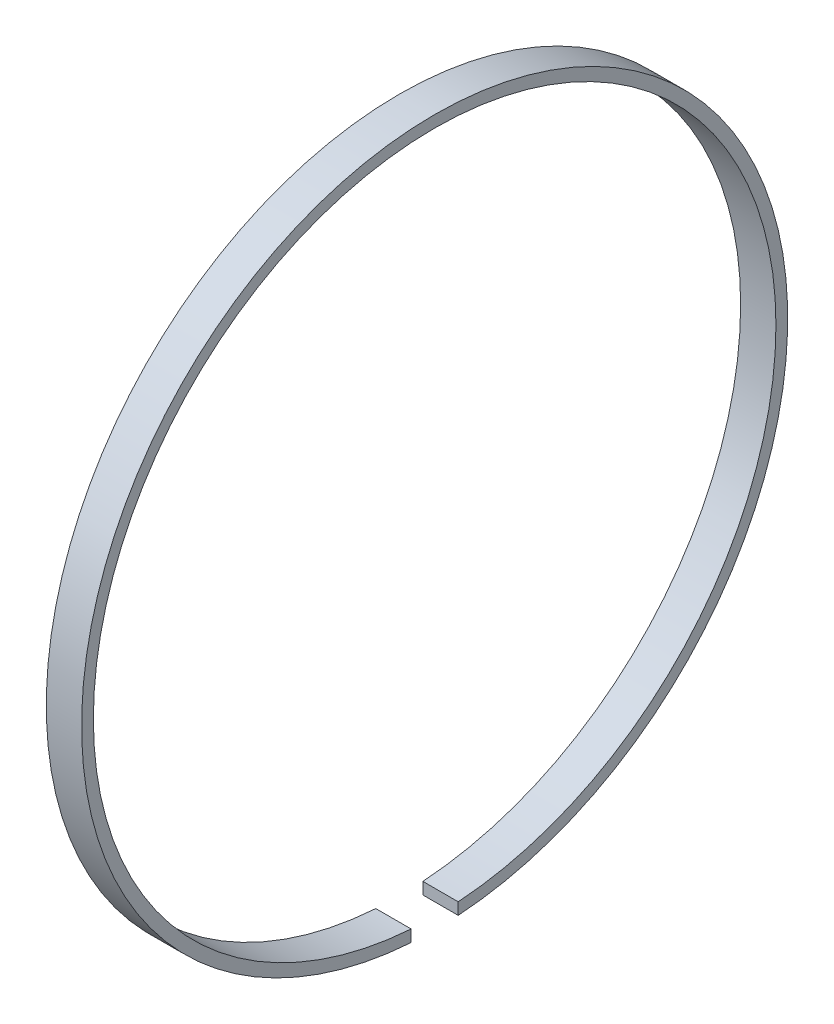
ISO-10303-21;
HEADER;
FILE_DESCRIPTION(('STEP AP214'),'2;1');
FILE_NAME('part.step','',(''),(''),'','','');
FILE_SCHEMA(('AUTOMOTIVE_DESIGN { 1 0 10303 214 1 1 1 1 }'));
ENDSEC;
DATA;
#1=APPLICATION_CONTEXT('core data for automotive mechanical design processes');
#2=APPLICATION_PROTOCOL_DEFINITION('international standard','automotive_design',2000,#1);
#3=PRODUCT_CONTEXT('',#1,'mechanical');
#4=PRODUCT('Part','Part','',(#3));
#5=PRODUCT_RELATED_PRODUCT_CATEGORY('part','',(#4));
#6=PRODUCT_DEFINITION_FORMATION('','',#4);
#7=PRODUCT_DEFINITION_CONTEXT('part definition',#1,'design');
#8=PRODUCT_DEFINITION('design','',#6,#7);
#9=PRODUCT_DEFINITION_SHAPE('','',#8);
#10=(LENGTH_UNIT() NAMED_UNIT(*) SI_UNIT(.MILLI.,.METRE.));
#11=(NAMED_UNIT(*) PLANE_ANGLE_UNIT() SI_UNIT($,.RADIAN.));
#12=(NAMED_UNIT(*) SI_UNIT($,.STERADIAN.) SOLID_ANGLE_UNIT());
#13=UNCERTAINTY_MEASURE_WITH_UNIT(LENGTH_MEASURE(1.E-05),#10,'distance_accuracy_value','');
#14=(GEOMETRIC_REPRESENTATION_CONTEXT(3) GLOBAL_UNCERTAINTY_ASSIGNED_CONTEXT((#13)) GLOBAL_UNIT_ASSIGNED_CONTEXT((#10,
#11,#12)) REPRESENTATION_CONTEXT('',''));
#15=CARTESIAN_POINT('',(0.,0.,0.));
#16=DIRECTION('',(0.,0.,1.));
#17=DIRECTION('',(1.,0.,0.));
#18=AXIS2_PLACEMENT_3D('',#15,#16,#17);
#19=CARTESIAN_POINT('',(1.5,0.,0.));
#20=DIRECTION('',(-1.,0.,0.));
#21=DIRECTION('',(0.,0.,1.));
#22=AXIS2_PLACEMENT_3D('',#19,#20,#21);
#23=CYLINDRICAL_SURFACE('',#22,15.);
#24=CARTESIAN_POINT('',(0.,0.,0.));
#25=DIRECTION('',(1.,0.,0.));
#26=DIRECTION('',(0.,0.,-1.));
#27=AXIS2_PLACEMENT_3D('',#24,#25,#26);
#28=CIRCLE('',#27,15.);
#29=CARTESIAN_POINT('',(0.,-14.9666295470958,-1.));
#30=VERTEX_POINT('',#29);
#31=CARTESIAN_POINT('',(0.,-14.9666295470958,1.));
#32=VERTEX_POINT('',#31);
#33=EDGE_CURVE('E96',#30,#32,#28,.T.);
#34=ORIENTED_EDGE('',*,*,#33,.T.);
#35=DIRECTION('',(-1.,0.,0.));
#36=VECTOR('',#35,1.);
#37=CARTESIAN_POINT('',(1.5,-14.9666295470958,1.));
#38=LINE('',#37,#36);
#39=CARTESIAN_POINT('',(1.5,-14.9666295470958,1.));
#40=VERTEX_POINT('',#39);
#41=EDGE_CURVE('E11',#40,#32,#38,.T.);
#42=ORIENTED_EDGE('',*,*,#41,.F.);
#43=CARTESIAN_POINT('',(1.5,0.,0.));
#44=DIRECTION('',(1.,0.,0.));
#45=DIRECTION('',(0.,0.,-1.));
#46=AXIS2_PLACEMENT_3D('',#43,#44,#45);
#47=CIRCLE('',#46,15.);
#48=CARTESIAN_POINT('',(1.5,-14.9666295470958,-1.));
#49=VERTEX_POINT('',#48);
#50=EDGE_CURVE('E84',#49,#40,#47,.T.);
#51=ORIENTED_EDGE('',*,*,#50,.F.);
#52=DIRECTION('',(-1.,0.,0.));
#53=VECTOR('',#52,1.);
#54=CARTESIAN_POINT('',(1.5,-14.9666295470958,-1.));
#55=LINE('',#54,#53);
#56=EDGE_CURVE('E92',#49,#30,#55,.T.);
#57=ORIENTED_EDGE('',*,*,#56,.T.);
#58=EDGE_LOOP('',(#34,#42,#51,#57));
#59=FACE_BOUND('',#58,.T.);
#60=ADVANCED_FACE('F33',(#59),#23,.T.);
#61=CARTESIAN_POINT('',(1.5,-14.4654761414894,1.));
#62=DIRECTION('',(0.,0.,1.));
#63=DIRECTION('',(1.,0.,0.));
#64=AXIS2_PLACEMENT_3D('',#61,#62,#63);
#65=PLANE('',#64);
#66=DIRECTION('',(0.,1.,0.));
#67=VECTOR('',#66,1.);
#68=CARTESIAN_POINT('',(0.,-14.4654761414894,1.));
#69=LINE('',#68,#67);
#70=CARTESIAN_POINT('',(0.,-14.4654761414894,1.));
#71=VERTEX_POINT('',#70);
#72=EDGE_CURVE('E88',#32,#71,#69,.T.);
#73=ORIENTED_EDGE('',*,*,#72,.T.);
#74=DIRECTION('',(-1.,0.,0.));
#75=VECTOR('',#74,1.);
#76=CARTESIAN_POINT('',(1.5,-14.4654761414894,1.));
#77=LINE('',#76,#75);
#78=CARTESIAN_POINT('',(1.5,-14.4654761414894,1.));
#79=VERTEX_POINT('',#78);
#80=EDGE_CURVE('E41',#79,#71,#77,.T.);
#81=ORIENTED_EDGE('',*,*,#80,.F.);
#82=DIRECTION('',(0.,1.,0.));
#83=VECTOR('',#82,1.);
#84=CARTESIAN_POINT('',(1.5,-14.4654761414894,1.));
#85=LINE('',#84,#83);
#86=EDGE_CURVE('E79',#40,#79,#85,.T.);
#87=ORIENTED_EDGE('',*,*,#86,.F.);
#88=ORIENTED_EDGE('',*,*,#41,.T.);
#89=EDGE_LOOP('',(#73,#81,#87,#88));
#90=FACE_BOUND('',#89,.T.);
#91=ADVANCED_FACE('F87',(#90),#65,.F.);
#92=CARTESIAN_POINT('',(1.5,0.,0.));
#93=DIRECTION('',(-1.,0.,0.));
#94=DIRECTION('',(0.,0.,1.));
#95=AXIS2_PLACEMENT_3D('',#92,#93,#94);
#96=CYLINDRICAL_SURFACE('',#95,14.5);
#97=CARTESIAN_POINT('',(0.,0.,0.));
#98=DIRECTION('',(-1.,0.,0.));
#99=DIRECTION('',(0.,0.,-1.));
#100=AXIS2_PLACEMENT_3D('',#97,#98,#99);
#101=CIRCLE('',#100,14.5);
#102=CARTESIAN_POINT('',(0.,-14.4654761414894,-0.999999999999997));
#103=VERTEX_POINT('',#102);
#104=EDGE_CURVE('E66',#71,#103,#101,.T.);
#105=ORIENTED_EDGE('',*,*,#104,.T.);
#106=DIRECTION('',(-1.,0.,0.));
#107=VECTOR('',#106,1.);
#108=CARTESIAN_POINT('',(1.5,-14.4654761414894,-0.999999999999997));
#109=LINE('',#108,#107);
#110=CARTESIAN_POINT('',(1.5,-14.4654761414894,-0.999999999999997));
#111=VERTEX_POINT('',#110);
#112=EDGE_CURVE('E89',#111,#103,#109,.T.);
#113=ORIENTED_EDGE('',*,*,#112,.F.);
#114=CARTESIAN_POINT('',(1.5,0.,0.));
#115=DIRECTION('',(-1.,0.,0.));
#116=DIRECTION('',(0.,0.,-1.));
#117=AXIS2_PLACEMENT_3D('',#114,#115,#116);
#118=CIRCLE('',#117,14.5);
#119=EDGE_CURVE('E82',#79,#111,#118,.T.);
#120=ORIENTED_EDGE('',*,*,#119,.F.);
#121=ORIENTED_EDGE('',*,*,#80,.T.);
#122=EDGE_LOOP('',(#105,#113,#120,#121));
#123=FACE_BOUND('',#122,.T.);
#124=ADVANCED_FACE('F90',(#123),#96,.F.);
#125=CARTESIAN_POINT('',(1.5,-14.4654761414894,-1.));
#126=DIRECTION('',(0.,0.,-1.));
#127=DIRECTION('',(-1.,0.,0.));
#128=AXIS2_PLACEMENT_3D('',#125,#126,#127);
#129=PLANE('',#128);
#130=DIRECTION('',(0.,-1.,0.));
#131=VECTOR('',#130,1.);
#132=CARTESIAN_POINT('',(0.,-14.4654761414894,-1.));
#133=LINE('',#132,#131);
#134=EDGE_CURVE('E72',#103,#30,#133,.T.);
#135=ORIENTED_EDGE('',*,*,#134,.T.);
#136=ORIENTED_EDGE('',*,*,#56,.F.);
#137=DIRECTION('',(0.,-1.,0.));
#138=VECTOR('',#137,1.);
#139=CARTESIAN_POINT('',(1.5,-14.4654761414894,-1.));
#140=LINE('',#139,#138);
#141=EDGE_CURVE('E49',#111,#49,#140,.T.);
#142=ORIENTED_EDGE('',*,*,#141,.F.);
#143=ORIENTED_EDGE('',*,*,#112,.T.);
#144=EDGE_LOOP('',(#135,#136,#142,#143));
#145=FACE_BOUND('',#144,.T.);
#146=ADVANCED_FACE('F103',(#145),#129,.F.);
#147=CARTESIAN_POINT('',(1.5,0.,0.));
#148=DIRECTION('',(1.,0.,0.));
#149=DIRECTION('',(0.,0.,-1.));
#150=AXIS2_PLACEMENT_3D('',#147,#148,#149);
#151=PLANE('',#150);
#152=ORIENTED_EDGE('',*,*,#50,.T.);
#153=ORIENTED_EDGE('',*,*,#86,.T.);
#154=ORIENTED_EDGE('',*,*,#119,.T.);
#155=ORIENTED_EDGE('',*,*,#141,.T.);
#156=EDGE_LOOP('',(#152,#153,#154,#155));
#157=FACE_BOUND('',#156,.T.);
#158=ADVANCED_FACE('F80',(#157),#151,.T.);
#159=CARTESIAN_POINT('',(0.,0.,0.));
#160=DIRECTION('',(1.,0.,0.));
#161=DIRECTION('',(0.,0.,-1.));
#162=AXIS2_PLACEMENT_3D('',#159,#160,#161);
#163=PLANE('',#162);
#164=ORIENTED_EDGE('',*,*,#33,.F.);
#165=ORIENTED_EDGE('',*,*,#134,.F.);
#166=ORIENTED_EDGE('',*,*,#104,.F.);
#167=ORIENTED_EDGE('',*,*,#72,.F.);
#168=EDGE_LOOP('',(#164,#165,#166,#167));
#169=FACE_BOUND('',#168,.T.);
#170=ADVANCED_FACE('F106',(#169),#163,.F.);
#171=CLOSED_SHELL('',(#60,#91,#124,#146,#158,#170));
#172=MANIFOLD_SOLID_BREP('B2',#171);
#173=ADVANCED_BREP_SHAPE_REPRESENTATION('',(#18,#172),#14);
#174=SHAPE_DEFINITION_REPRESENTATION(#9,#173);
ENDSEC;
END-ISO-10303-21;
